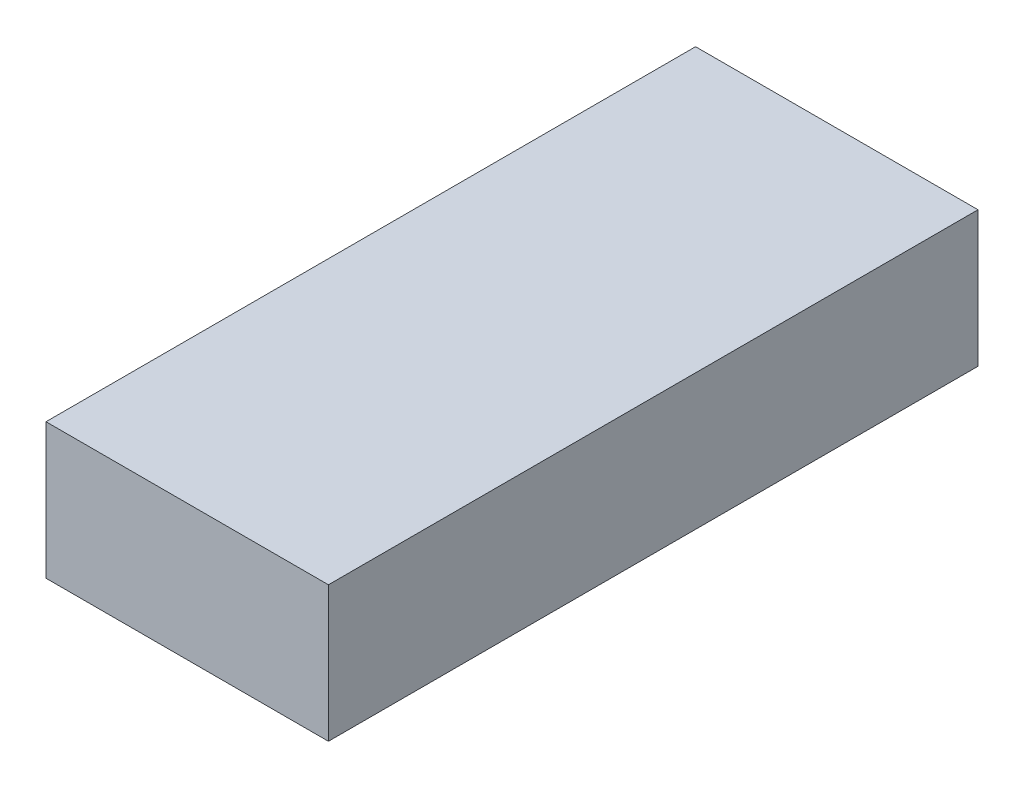
ISO-10303-21;
HEADER;
FILE_DESCRIPTION(('STEP AP214'),'2;1');
FILE_NAME('part.step','',(''),(''),'','','');
FILE_SCHEMA(('AUTOMOTIVE_DESIGN { 1 0 10303 214 1 1 1 1 }'));
ENDSEC;
DATA;
#1=APPLICATION_CONTEXT('core data for automotive mechanical design processes');
#2=APPLICATION_PROTOCOL_DEFINITION('international standard','automotive_design',2000,#1);
#3=PRODUCT_CONTEXT('',#1,'mechanical');
#4=PRODUCT('Part','Part','',(#3));
#5=PRODUCT_RELATED_PRODUCT_CATEGORY('part','',(#4));
#6=PRODUCT_DEFINITION_FORMATION('','',#4);
#7=PRODUCT_DEFINITION_CONTEXT('part definition',#1,'design');
#8=PRODUCT_DEFINITION('design','',#6,#7);
#9=PRODUCT_DEFINITION_SHAPE('','',#8);
#10=(LENGTH_UNIT() NAMED_UNIT(*) SI_UNIT(.MILLI.,.METRE.));
#11=(NAMED_UNIT(*) PLANE_ANGLE_UNIT() SI_UNIT($,.RADIAN.));
#12=(NAMED_UNIT(*) SI_UNIT($,.STERADIAN.) SOLID_ANGLE_UNIT());
#13=UNCERTAINTY_MEASURE_WITH_UNIT(LENGTH_MEASURE(1.E-05),#10,'distance_accuracy_value','');
#14=(GEOMETRIC_REPRESENTATION_CONTEXT(3) GLOBAL_UNCERTAINTY_ASSIGNED_CONTEXT((#13)) GLOBAL_UNIT_ASSIGNED_CONTEXT((#10,
#11,#12)) REPRESENTATION_CONTEXT('',''));
#15=CARTESIAN_POINT('',(0.,0.,0.));
#16=DIRECTION('',(0.,0.,1.));
#17=DIRECTION('',(1.,0.,0.));
#18=AXIS2_PLACEMENT_3D('',#15,#16,#17);
#19=CARTESIAN_POINT('',(10.,7.6,21.));
#20=DIRECTION('',(-1.,0.,0.));
#21=DIRECTION('',(0.,0.,1.));
#22=AXIS2_PLACEMENT_3D('',#19,#20,#21);
#23=PLANE('',#22);
#24=DIRECTION('',(0.,0.,-1.));
#25=VECTOR('',#24,1.);
#26=CARTESIAN_POINT('',(10.,0.,21.));
#27=LINE('',#26,#25);
#28=CARTESIAN_POINT('',(10.,0.,23.));
#29=VERTEX_POINT('',#28);
#30=CARTESIAN_POINT('',(10.,0.,-23.));
#31=VERTEX_POINT('',#30);
#32=EDGE_CURVE('E53',#29,#31,#27,.T.);
#33=ORIENTED_EDGE('',*,*,#32,.T.);
#34=DIRECTION('',(0.,1.,0.));
#35=VECTOR('',#34,1.);
#36=CARTESIAN_POINT('',(10.,7.6,-23.));
#37=LINE('',#36,#35);
#38=CARTESIAN_POINT('',(10.,9.6,-23.));
#39=VERTEX_POINT('',#38);
#40=EDGE_CURVE('E257',#39,#31,#37,.F.);
#41=ORIENTED_EDGE('',*,*,#40,.F.);
#42=DIRECTION('',(0.,0.,-1.));
#43=VECTOR('',#42,1.);
#44=CARTESIAN_POINT('',(10.,9.6,0.));
#45=LINE('',#44,#43);
#46=CARTESIAN_POINT('',(10.,9.6,23.));
#47=VERTEX_POINT('',#46);
#48=EDGE_CURVE('E240',#47,#39,#45,.T.);
#49=ORIENTED_EDGE('',*,*,#48,.F.);
#50=DIRECTION('',(0.,1.,0.));
#51=VECTOR('',#50,1.);
#52=CARTESIAN_POINT('',(10.,7.6,23.));
#53=LINE('',#52,#51);
#54=EDGE_CURVE('E261',#47,#29,#53,.F.);
#55=ORIENTED_EDGE('',*,*,#54,.T.);
#56=EDGE_LOOP('',(#33,#41,#49,#55));
#57=FACE_BOUND('',#56,.T.);
#58=ADVANCED_FACE('F46',(#57),#23,.F.);
#59=CARTESIAN_POINT('',(-10.,7.6,21.));
#60=DIRECTION('',(1.,0.,0.));
#61=DIRECTION('',(0.,0.,-1.));
#62=AXIS2_PLACEMENT_3D('',#59,#60,#61);
#63=PLANE('',#62);
#64=DIRECTION('',(0.,1.,0.));
#65=VECTOR('',#64,1.);
#66=CARTESIAN_POINT('',(-10.,7.6,-23.));
#67=LINE('',#66,#65);
#68=CARTESIAN_POINT('',(-10.,9.6,-23.));
#69=VERTEX_POINT('',#68);
#70=CARTESIAN_POINT('',(-10.,0.,-23.));
#71=VERTEX_POINT('',#70);
#72=EDGE_CURVE('E255',#69,#71,#67,.F.);
#73=ORIENTED_EDGE('',*,*,#72,.T.);
#74=DIRECTION('',(0.,0.,1.));
#75=VECTOR('',#74,1.);
#76=CARTESIAN_POINT('',(-10.,0.,21.));
#77=LINE('',#76,#75);
#78=CARTESIAN_POINT('',(-10.,0.,23.));
#79=VERTEX_POINT('',#78);
#80=EDGE_CURVE('E11',#71,#79,#77,.T.);
#81=ORIENTED_EDGE('',*,*,#80,.T.);
#82=DIRECTION('',(0.,1.,0.));
#83=VECTOR('',#82,1.);
#84=CARTESIAN_POINT('',(-10.,7.6,23.));
#85=LINE('',#84,#83);
#86=CARTESIAN_POINT('',(-10.,9.6,23.));
#87=VERTEX_POINT('',#86);
#88=EDGE_CURVE('E256',#87,#79,#85,.F.);
#89=ORIENTED_EDGE('',*,*,#88,.F.);
#90=DIRECTION('',(0.,0.,-1.));
#91=VECTOR('',#90,1.);
#92=CARTESIAN_POINT('',(-10.,9.6,0.));
#93=LINE('',#92,#91);
#94=EDGE_CURVE('E247',#69,#87,#93,.F.);
#95=ORIENTED_EDGE('',*,*,#94,.F.);
#96=EDGE_LOOP('',(#73,#81,#89,#95));
#97=FACE_BOUND('',#96,.T.);
#98=ADVANCED_FACE('F414',(#97),#63,.F.);
#99=CARTESIAN_POINT('',(0.,0.,0.));
#100=DIRECTION('',(0.,-1.,0.));
#101=DIRECTION('',(0.,0.,-1.));
#102=AXIS2_PLACEMENT_3D('',#99,#100,#101);
#103=PLANE('',#102);
#104=CARTESIAN_POINT('',(-5.5,0.,-5.50000000000001));
#105=DIRECTION('',(0.,1.,0.));
#106=DIRECTION('',(0.,0.,-1.));
#107=AXIS2_PLACEMENT_3D('',#104,#105,#106);
#108=CIRCLE('',#107,2.);
#109=CARTESIAN_POINT('',(-5.50000000000001,0.,-3.5));
#110=VERTEX_POINT('',#109);
#111=CARTESIAN_POINT('',(-3.5,0.,-5.50000000000002));
#112=VERTEX_POINT('',#111);
#113=EDGE_CURVE('E68',#110,#112,#108,.T.);
#114=ORIENTED_EDGE('',*,*,#113,.F.);
#115=DIRECTION('',(1.,0.,0.));
#116=VECTOR('',#115,1.);
#117=CARTESIAN_POINT('',(-8.5,0.,-3.5));
#118=LINE('',#117,#116);
#119=CARTESIAN_POINT('',(-8.5,0.,-3.5));
#120=VERTEX_POINT('',#119);
#121=EDGE_CURVE('E275',#120,#110,#118,.T.);
#122=ORIENTED_EDGE('',*,*,#121,.F.);
#123=DIRECTION('',(0.,0.,-1.));
#124=VECTOR('',#123,1.);
#125=CARTESIAN_POINT('',(-8.5,0.,-3.5));
#126=LINE('',#125,#124);
#127=CARTESIAN_POINT('',(-8.5,0.,0.499999999999995));
#128=VERTEX_POINT('',#127);
#129=EDGE_CURVE('E361',#128,#120,#126,.T.);
#130=ORIENTED_EDGE('',*,*,#129,.F.);
#131=DIRECTION('',(-1.,0.,0.));
#132=VECTOR('',#131,1.);
#133=CARTESIAN_POINT('',(-8.5,0.,0.499999999999995));
#134=LINE('',#133,#132);
#135=CARTESIAN_POINT('',(-5.50000000000001,0.,0.499999999999996));
#136=VERTEX_POINT('',#135);
#137=EDGE_CURVE('E358',#136,#128,#134,.T.);
#138=ORIENTED_EDGE('',*,*,#137,.F.);
#139=CARTESIAN_POINT('',(-5.5,0.,2.5));
#140=DIRECTION('',(0.,1.,0.));
#141=DIRECTION('',(0.,0.,1.));
#142=AXIS2_PLACEMENT_3D('',#139,#140,#141);
#143=CIRCLE('',#142,2.);
#144=CARTESIAN_POINT('',(-3.5,0.,2.50000000000001));
#145=VERTEX_POINT('',#144);
#146=EDGE_CURVE('E355',#145,#136,#143,.T.);
#147=ORIENTED_EDGE('',*,*,#146,.F.);
#148=DIRECTION('',(0.,0.,-1.));
#149=VECTOR('',#148,1.);
#150=CARTESIAN_POINT('',(-3.5,0.,2.50000000000001));
#151=LINE('',#150,#149);
#152=CARTESIAN_POINT('',(-3.5,0.,17.5));
#153=VERTEX_POINT('',#152);
#154=EDGE_CURVE('E352',#153,#145,#151,.T.);
#155=ORIENTED_EDGE('',*,*,#154,.F.);
#156=DIRECTION('',(-1.,0.,0.));
#157=VECTOR('',#156,1.);
#158=CARTESIAN_POINT('',(-3.5,0.,17.5));
#159=LINE('',#158,#157);
#160=CARTESIAN_POINT('',(3.5,0.,17.5));
#161=VERTEX_POINT('',#160);
#162=EDGE_CURVE('E349',#161,#153,#159,.T.);
#163=ORIENTED_EDGE('',*,*,#162,.F.);
#164=DIRECTION('',(0.,0.,1.));
#165=VECTOR('',#164,1.);
#166=CARTESIAN_POINT('',(3.5,0.,2.50000000000001));
#167=LINE('',#166,#165);
#168=CARTESIAN_POINT('',(3.5,0.,2.50000000000001));
#169=VERTEX_POINT('',#168);
#170=EDGE_CURVE('E346',#169,#161,#167,.T.);
#171=ORIENTED_EDGE('',*,*,#170,.F.);
#172=CARTESIAN_POINT('',(5.5,0.,2.5));
#173=DIRECTION('',(0.,1.,0.));
#174=DIRECTION('',(0.,0.,1.));
#175=AXIS2_PLACEMENT_3D('',#172,#173,#174);
#176=CIRCLE('',#175,2.);
#177=CARTESIAN_POINT('',(5.50000000000002,0.,0.499999999999998));
#178=VERTEX_POINT('',#177);
#179=EDGE_CURVE('E343',#178,#169,#176,.T.);
#180=ORIENTED_EDGE('',*,*,#179,.F.);
#181=DIRECTION('',(-1.,0.,0.));
#182=VECTOR('',#181,1.);
#183=CARTESIAN_POINT('',(5.50000000000002,0.,0.499999999999998));
#184=LINE('',#183,#182);
#185=CARTESIAN_POINT('',(8.50000000000001,0.,0.499999999999997));
#186=VERTEX_POINT('',#185);
#187=EDGE_CURVE('E340',#186,#178,#184,.T.);
#188=ORIENTED_EDGE('',*,*,#187,.F.);
#189=DIRECTION('',(0.,0.,1.));
#190=VECTOR('',#189,1.);
#191=CARTESIAN_POINT('',(8.50000000000001,0.,-3.5));
#192=LINE('',#191,#190);
#193=CARTESIAN_POINT('',(8.50000000000001,0.,-3.5));
#194=VERTEX_POINT('',#193);
#195=EDGE_CURVE('E337',#194,#186,#192,.T.);
#196=ORIENTED_EDGE('',*,*,#195,.F.);
#197=DIRECTION('',(1.,0.,0.));
#198=VECTOR('',#197,1.);
#199=CARTESIAN_POINT('',(5.50000000000002,0.,-3.5));
#200=LINE('',#199,#198);
#201=CARTESIAN_POINT('',(5.5,0.,-3.5));
#202=VERTEX_POINT('',#201);
#203=EDGE_CURVE('E334',#202,#194,#200,.T.);
#204=ORIENTED_EDGE('',*,*,#203,.F.);
#205=CARTESIAN_POINT('',(5.5,0.,-5.5));
#206=DIRECTION('',(0.,1.,0.));
#207=DIRECTION('',(0.,0.,1.));
#208=AXIS2_PLACEMENT_3D('',#205,#206,#207);
#209=CIRCLE('',#208,2.);
#210=CARTESIAN_POINT('',(3.5,0.,-5.50000000000002));
#211=VERTEX_POINT('',#210);
#212=EDGE_CURVE('E331',#211,#202,#209,.T.);
#213=ORIENTED_EDGE('',*,*,#212,.F.);
#214=DIRECTION('',(0.,0.,1.));
#215=VECTOR('',#214,1.);
#216=CARTESIAN_POINT('',(3.5,0.,-17.5));
#217=LINE('',#216,#215);
#218=CARTESIAN_POINT('',(3.5,0.,-17.5));
#219=VERTEX_POINT('',#218);
#220=EDGE_CURVE('E328',#219,#211,#217,.T.);
#221=ORIENTED_EDGE('',*,*,#220,.F.);
#222=DIRECTION('',(1.,0.,0.));
#223=VECTOR('',#222,1.);
#224=CARTESIAN_POINT('',(-3.5,0.,-17.5));
#225=LINE('',#224,#223);
#226=CARTESIAN_POINT('',(-3.5,0.,-17.5));
#227=VERTEX_POINT('',#226);
#228=EDGE_CURVE('E325',#227,#219,#225,.T.);
#229=ORIENTED_EDGE('',*,*,#228,.F.);
#230=DIRECTION('',(0.,0.,-1.));
#231=VECTOR('',#230,1.);
#232=CARTESIAN_POINT('',(-3.5,0.,-17.5));
#233=LINE('',#232,#231);
#234=EDGE_CURVE('E322',#112,#227,#233,.T.);
#235=ORIENTED_EDGE('',*,*,#234,.F.);
#236=EDGE_LOOP('',(#114,#122,#130,#138,#147,#155,#163,#171,#180,#188,#196,#204,#213,#221,#229,#235));
#237=FACE_BOUND('',#236,.T.);
#238=ORIENTED_EDGE('',*,*,#32,.F.);
#239=DIRECTION('',(-1.,0.,0.));
#240=VECTOR('',#239,1.);
#241=CARTESIAN_POINT('',(-10.,0.,23.));
#242=LINE('',#241,#240);
#243=EDGE_CURVE('E251',#79,#29,#242,.F.);
#244=ORIENTED_EDGE('',*,*,#243,.F.);
#245=ORIENTED_EDGE('',*,*,#80,.F.);
#246=DIRECTION('',(1.,0.,0.));
#247=VECTOR('',#246,1.);
#248=CARTESIAN_POINT('',(-10.,0.,-23.));
#249=LINE('',#248,#247);
#250=EDGE_CURVE('E252',#31,#71,#249,.F.);
#251=ORIENTED_EDGE('',*,*,#250,.F.);
#252=EDGE_LOOP('',(#238,#244,#245,#251));
#253=FACE_BOUND('',#252,.T.);
#254=ADVANCED_FACE('F403',(#237,#253),#103,.T.);
#255=CARTESIAN_POINT('',(-5.5,4.,-5.50000000000001));
#256=DIRECTION('',(0.,-1.,0.));
#257=DIRECTION('',(0.,0.,-1.));
#258=AXIS2_PLACEMENT_3D('',#255,#256,#257);
#259=CYLINDRICAL_SURFACE('',#258,2.);
#260=ORIENTED_EDGE('',*,*,#113,.T.);
#261=DIRECTION('',(0.,-1.,0.));
#262=VECTOR('',#261,1.);
#263=CARTESIAN_POINT('',(-3.5,4.,-5.50000000000002));
#264=LINE('',#263,#262);
#265=CARTESIAN_POINT('',(-3.5,4.,-5.50000000000002));
#266=VERTEX_POINT('',#265);
#267=EDGE_CURVE('E320',#266,#112,#264,.T.);
#268=ORIENTED_EDGE('',*,*,#267,.F.);
#269=CARTESIAN_POINT('',(-5.5,4.,-5.50000000000001));
#270=DIRECTION('',(0.,1.,0.));
#271=DIRECTION('',(0.,0.,-1.));
#272=AXIS2_PLACEMENT_3D('',#269,#270,#271);
#273=CIRCLE('',#272,2.);
#274=CARTESIAN_POINT('',(-5.50000000000001,4.,-3.5));
#275=VERTEX_POINT('',#274);
#276=EDGE_CURVE('E271',#275,#266,#273,.T.);
#277=ORIENTED_EDGE('',*,*,#276,.F.);
#278=DIRECTION('',(0.,-1.,0.));
#279=VECTOR('',#278,1.);
#280=CARTESIAN_POINT('',(-5.50000000000001,4.,-3.5));
#281=LINE('',#280,#279);
#282=EDGE_CURVE('E366',#275,#110,#281,.T.);
#283=ORIENTED_EDGE('',*,*,#282,.T.);
#284=EDGE_LOOP('',(#260,#268,#277,#283));
#285=FACE_BOUND('',#284,.T.);
#286=ADVANCED_FACE('F420',(#285),#259,.T.);
#287=CARTESIAN_POINT('',(-8.5,4.,-3.5));
#288=DIRECTION('',(0.,0.,-1.));
#289=DIRECTION('',(-1.,0.,0.));
#290=AXIS2_PLACEMENT_3D('',#287,#288,#289);
#291=PLANE('',#290);
#292=ORIENTED_EDGE('',*,*,#121,.T.);
#293=ORIENTED_EDGE('',*,*,#282,.F.);
#294=DIRECTION('',(1.,0.,0.));
#295=VECTOR('',#294,1.);
#296=CARTESIAN_POINT('',(-8.5,4.,-3.5));
#297=LINE('',#296,#295);
#298=CARTESIAN_POINT('',(-8.5,4.,-3.5));
#299=VERTEX_POINT('',#298);
#300=EDGE_CURVE('E317',#299,#275,#297,.T.);
#301=ORIENTED_EDGE('',*,*,#300,.F.);
#302=DIRECTION('',(0.,-1.,0.));
#303=VECTOR('',#302,1.);
#304=CARTESIAN_POINT('',(-8.5,4.,-3.5));
#305=LINE('',#304,#303);
#306=EDGE_CURVE('E368',#299,#120,#305,.T.);
#307=ORIENTED_EDGE('',*,*,#306,.T.);
#308=EDGE_LOOP('',(#292,#293,#301,#307));
#309=FACE_BOUND('',#308,.T.);
#310=ADVANCED_FACE('F426',(#309),#291,.F.);
#311=CARTESIAN_POINT('',(-8.5,4.,-3.5));
#312=DIRECTION('',(-1.,0.,0.));
#313=DIRECTION('',(0.,0.,1.));
#314=AXIS2_PLACEMENT_3D('',#311,#312,#313);
#315=PLANE('',#314);
#316=ORIENTED_EDGE('',*,*,#129,.T.);
#317=ORIENTED_EDGE('',*,*,#306,.F.);
#318=DIRECTION('',(0.,0.,-1.));
#319=VECTOR('',#318,1.);
#320=CARTESIAN_POINT('',(-8.5,4.,-3.5));
#321=LINE('',#320,#319);
#322=CARTESIAN_POINT('',(-8.5,4.,0.499999999999995));
#323=VERTEX_POINT('',#322);
#324=EDGE_CURVE('E314',#323,#299,#321,.T.);
#325=ORIENTED_EDGE('',*,*,#324,.F.);
#326=DIRECTION('',(0.,-1.,0.));
#327=VECTOR('',#326,1.);
#328=CARTESIAN_POINT('',(-8.5,4.,0.499999999999995));
#329=LINE('',#328,#327);
#330=EDGE_CURVE('E370',#323,#128,#329,.T.);
#331=ORIENTED_EDGE('',*,*,#330,.T.);
#332=EDGE_LOOP('',(#316,#317,#325,#331));
#333=FACE_BOUND('',#332,.T.);
#334=ADVANCED_FACE('F479',(#333),#315,.F.);
#335=CARTESIAN_POINT('',(-8.5,4.,0.499999999999995));
#336=DIRECTION('',(0.,0.,1.));
#337=DIRECTION('',(1.,0.,0.));
#338=AXIS2_PLACEMENT_3D('',#335,#336,#337);
#339=PLANE('',#338);
#340=ORIENTED_EDGE('',*,*,#137,.T.);
#341=ORIENTED_EDGE('',*,*,#330,.F.);
#342=DIRECTION('',(-1.,0.,0.));
#343=VECTOR('',#342,1.);
#344=CARTESIAN_POINT('',(-8.5,4.,0.499999999999995));
#345=LINE('',#344,#343);
#346=CARTESIAN_POINT('',(-5.50000000000001,4.,0.499999999999996));
#347=VERTEX_POINT('',#346);
#348=EDGE_CURVE('E311',#347,#323,#345,.T.);
#349=ORIENTED_EDGE('',*,*,#348,.F.);
#350=DIRECTION('',(0.,-1.,0.));
#351=VECTOR('',#350,1.);
#352=CARTESIAN_POINT('',(-5.50000000000001,4.,0.499999999999996));
#353=LINE('',#352,#351);
#354=EDGE_CURVE('E372',#347,#136,#353,.T.);
#355=ORIENTED_EDGE('',*,*,#354,.T.);
#356=EDGE_LOOP('',(#340,#341,#349,#355));
#357=FACE_BOUND('',#356,.T.);
#358=ADVANCED_FACE('F475',(#357),#339,.F.);
#359=CARTESIAN_POINT('',(-5.5,4.,2.5));
#360=DIRECTION('',(0.,-1.,0.));
#361=DIRECTION('',(0.,0.,-1.));
#362=AXIS2_PLACEMENT_3D('',#359,#360,#361);
#363=CYLINDRICAL_SURFACE('',#362,2.);
#364=ORIENTED_EDGE('',*,*,#146,.T.);
#365=ORIENTED_EDGE('',*,*,#354,.F.);
#366=CARTESIAN_POINT('',(-5.5,4.,2.5));
#367=DIRECTION('',(0.,1.,0.));
#368=DIRECTION('',(0.,0.,1.));
#369=AXIS2_PLACEMENT_3D('',#366,#367,#368);
#370=CIRCLE('',#369,2.);
#371=CARTESIAN_POINT('',(-3.5,4.,2.50000000000001));
#372=VERTEX_POINT('',#371);
#373=EDGE_CURVE('E308',#372,#347,#370,.T.);
#374=ORIENTED_EDGE('',*,*,#373,.F.);
#375=DIRECTION('',(0.,-1.,0.));
#376=VECTOR('',#375,1.);
#377=CARTESIAN_POINT('',(-3.5,4.,2.50000000000001));
#378=LINE('',#377,#376);
#379=EDGE_CURVE('E374',#372,#145,#378,.T.);
#380=ORIENTED_EDGE('',*,*,#379,.T.);
#381=EDGE_LOOP('',(#364,#365,#374,#380));
#382=FACE_BOUND('',#381,.T.);
#383=ADVANCED_FACE('F471',(#382),#363,.T.);
#384=CARTESIAN_POINT('',(-3.5,4.,2.50000000000001));
#385=DIRECTION('',(-1.,0.,0.));
#386=DIRECTION('',(0.,0.,1.));
#387=AXIS2_PLACEMENT_3D('',#384,#385,#386);
#388=PLANE('',#387);
#389=ORIENTED_EDGE('',*,*,#154,.T.);
#390=ORIENTED_EDGE('',*,*,#379,.F.);
#391=DIRECTION('',(0.,0.,-1.));
#392=VECTOR('',#391,1.);
#393=CARTESIAN_POINT('',(-3.5,4.,2.50000000000001));
#394=LINE('',#393,#392);
#395=CARTESIAN_POINT('',(-3.5,4.,17.5));
#396=VERTEX_POINT('',#395);
#397=EDGE_CURVE('E305',#396,#372,#394,.T.);
#398=ORIENTED_EDGE('',*,*,#397,.F.);
#399=DIRECTION('',(0.,-1.,0.));
#400=VECTOR('',#399,1.);
#401=CARTESIAN_POINT('',(-3.5,4.,17.5));
#402=LINE('',#401,#400);
#403=EDGE_CURVE('E376',#396,#153,#402,.T.);
#404=ORIENTED_EDGE('',*,*,#403,.T.);
#405=EDGE_LOOP('',(#389,#390,#398,#404));
#406=FACE_BOUND('',#405,.T.);
#407=ADVANCED_FACE('F467',(#406),#388,.F.);
#408=CARTESIAN_POINT('',(-3.5,4.,17.5));
#409=DIRECTION('',(0.,0.,1.));
#410=DIRECTION('',(1.,0.,0.));
#411=AXIS2_PLACEMENT_3D('',#408,#409,#410);
#412=PLANE('',#411);
#413=ORIENTED_EDGE('',*,*,#162,.T.);
#414=ORIENTED_EDGE('',*,*,#403,.F.);
#415=DIRECTION('',(-1.,0.,0.));
#416=VECTOR('',#415,1.);
#417=CARTESIAN_POINT('',(-3.5,4.,17.5));
#418=LINE('',#417,#416);
#419=CARTESIAN_POINT('',(3.5,4.,17.5));
#420=VERTEX_POINT('',#419);
#421=EDGE_CURVE('E302',#420,#396,#418,.T.);
#422=ORIENTED_EDGE('',*,*,#421,.F.);
#423=DIRECTION('',(0.,-1.,0.));
#424=VECTOR('',#423,1.);
#425=CARTESIAN_POINT('',(3.5,4.,17.5));
#426=LINE('',#425,#424);
#427=EDGE_CURVE('E378',#420,#161,#426,.T.);
#428=ORIENTED_EDGE('',*,*,#427,.T.);
#429=EDGE_LOOP('',(#413,#414,#422,#428));
#430=FACE_BOUND('',#429,.T.);
#431=ADVANCED_FACE('F463',(#430),#412,.F.);
#432=CARTESIAN_POINT('',(3.5,4.,2.50000000000001));
#433=DIRECTION('',(1.,0.,0.));
#434=DIRECTION('',(0.,0.,-1.));
#435=AXIS2_PLACEMENT_3D('',#432,#433,#434);
#436=PLANE('',#435);
#437=ORIENTED_EDGE('',*,*,#170,.T.);
#438=ORIENTED_EDGE('',*,*,#427,.F.);
#439=DIRECTION('',(0.,0.,1.));
#440=VECTOR('',#439,1.);
#441=CARTESIAN_POINT('',(3.5,4.,2.50000000000001));
#442=LINE('',#441,#440);
#443=CARTESIAN_POINT('',(3.5,4.,2.50000000000001));
#444=VERTEX_POINT('',#443);
#445=EDGE_CURVE('E299',#444,#420,#442,.T.);
#446=ORIENTED_EDGE('',*,*,#445,.F.);
#447=DIRECTION('',(0.,-1.,0.));
#448=VECTOR('',#447,1.);
#449=CARTESIAN_POINT('',(3.5,4.,2.50000000000001));
#450=LINE('',#449,#448);
#451=EDGE_CURVE('E380',#444,#169,#450,.T.);
#452=ORIENTED_EDGE('',*,*,#451,.T.);
#453=EDGE_LOOP('',(#437,#438,#446,#452));
#454=FACE_BOUND('',#453,.T.);
#455=ADVANCED_FACE('F459',(#454),#436,.F.);
#456=CARTESIAN_POINT('',(5.5,4.,2.5));
#457=DIRECTION('',(0.,-1.,0.));
#458=DIRECTION('',(0.,0.,-1.));
#459=AXIS2_PLACEMENT_3D('',#456,#457,#458);
#460=CYLINDRICAL_SURFACE('',#459,2.);
#461=ORIENTED_EDGE('',*,*,#179,.T.);
#462=ORIENTED_EDGE('',*,*,#451,.F.);
#463=CARTESIAN_POINT('',(5.5,4.,2.5));
#464=DIRECTION('',(0.,1.,0.));
#465=DIRECTION('',(0.,0.,1.));
#466=AXIS2_PLACEMENT_3D('',#463,#464,#465);
#467=CIRCLE('',#466,2.);
#468=CARTESIAN_POINT('',(5.50000000000002,4.,0.499999999999998));
#469=VERTEX_POINT('',#468);
#470=EDGE_CURVE('E296',#469,#444,#467,.T.);
#471=ORIENTED_EDGE('',*,*,#470,.F.);
#472=DIRECTION('',(0.,-1.,0.));
#473=VECTOR('',#472,1.);
#474=CARTESIAN_POINT('',(5.50000000000002,4.,0.499999999999998));
#475=LINE('',#474,#473);
#476=EDGE_CURVE('E382',#469,#178,#475,.T.);
#477=ORIENTED_EDGE('',*,*,#476,.T.);
#478=EDGE_LOOP('',(#461,#462,#471,#477));
#479=FACE_BOUND('',#478,.T.);
#480=ADVANCED_FACE('F455',(#479),#460,.T.);
#481=CARTESIAN_POINT('',(5.50000000000002,4.,0.499999999999998));
#482=DIRECTION('',(0.,0.,1.));
#483=DIRECTION('',(1.,0.,0.));
#484=AXIS2_PLACEMENT_3D('',#481,#482,#483);
#485=PLANE('',#484);
#486=ORIENTED_EDGE('',*,*,#187,.T.);
#487=ORIENTED_EDGE('',*,*,#476,.F.);
#488=DIRECTION('',(-1.,0.,0.));
#489=VECTOR('',#488,1.);
#490=CARTESIAN_POINT('',(5.50000000000002,4.,0.499999999999998));
#491=LINE('',#490,#489);
#492=CARTESIAN_POINT('',(8.50000000000001,4.,0.499999999999997));
#493=VERTEX_POINT('',#492);
#494=EDGE_CURVE('E293',#493,#469,#491,.T.);
#495=ORIENTED_EDGE('',*,*,#494,.F.);
#496=DIRECTION('',(0.,-1.,0.));
#497=VECTOR('',#496,1.);
#498=CARTESIAN_POINT('',(8.50000000000001,4.,0.499999999999997));
#499=LINE('',#498,#497);
#500=EDGE_CURVE('E384',#493,#186,#499,.T.);
#501=ORIENTED_EDGE('',*,*,#500,.T.);
#502=EDGE_LOOP('',(#486,#487,#495,#501));
#503=FACE_BOUND('',#502,.T.);
#504=ADVANCED_FACE('F451',(#503),#485,.F.);
#505=CARTESIAN_POINT('',(8.50000000000001,4.,-3.5));
#506=DIRECTION('',(1.,0.,0.));
#507=DIRECTION('',(0.,0.,-1.));
#508=AXIS2_PLACEMENT_3D('',#505,#506,#507);
#509=PLANE('',#508);
#510=ORIENTED_EDGE('',*,*,#195,.T.);
#511=ORIENTED_EDGE('',*,*,#500,.F.);
#512=DIRECTION('',(0.,0.,1.));
#513=VECTOR('',#512,1.);
#514=CARTESIAN_POINT('',(8.50000000000001,4.,-3.5));
#515=LINE('',#514,#513);
#516=CARTESIAN_POINT('',(8.50000000000001,4.,-3.5));
#517=VERTEX_POINT('',#516);
#518=EDGE_CURVE('E290',#517,#493,#515,.T.);
#519=ORIENTED_EDGE('',*,*,#518,.F.);
#520=DIRECTION('',(0.,-1.,0.));
#521=VECTOR('',#520,1.);
#522=CARTESIAN_POINT('',(8.50000000000001,4.,-3.5));
#523=LINE('',#522,#521);
#524=EDGE_CURVE('E386',#517,#194,#523,.T.);
#525=ORIENTED_EDGE('',*,*,#524,.T.);
#526=EDGE_LOOP('',(#510,#511,#519,#525));
#527=FACE_BOUND('',#526,.T.);
#528=ADVANCED_FACE('F447',(#527),#509,.F.);
#529=CARTESIAN_POINT('',(5.50000000000002,4.,-3.5));
#530=DIRECTION('',(0.,0.,-1.));
#531=DIRECTION('',(-1.,0.,0.));
#532=AXIS2_PLACEMENT_3D('',#529,#530,#531);
#533=PLANE('',#532);
#534=ORIENTED_EDGE('',*,*,#203,.T.);
#535=ORIENTED_EDGE('',*,*,#524,.F.);
#536=DIRECTION('',(1.,0.,0.));
#537=VECTOR('',#536,1.);
#538=CARTESIAN_POINT('',(5.50000000000002,4.,-3.5));
#539=LINE('',#538,#537);
#540=CARTESIAN_POINT('',(5.5,4.,-3.5));
#541=VERTEX_POINT('',#540);
#542=EDGE_CURVE('E287',#541,#517,#539,.T.);
#543=ORIENTED_EDGE('',*,*,#542,.F.);
#544=DIRECTION('',(0.,-1.,0.));
#545=VECTOR('',#544,1.);
#546=CARTESIAN_POINT('',(5.5,4.,-3.5));
#547=LINE('',#546,#545);
#548=EDGE_CURVE('E388',#541,#202,#547,.T.);
#549=ORIENTED_EDGE('',*,*,#548,.T.);
#550=EDGE_LOOP('',(#534,#535,#543,#549));
#551=FACE_BOUND('',#550,.T.);
#552=ADVANCED_FACE('F443',(#551),#533,.F.);
#553=CARTESIAN_POINT('',(5.5,4.,-5.5));
#554=DIRECTION('',(0.,-1.,0.));
#555=DIRECTION('',(0.,0.,-1.));
#556=AXIS2_PLACEMENT_3D('',#553,#554,#555);
#557=CYLINDRICAL_SURFACE('',#556,2.);
#558=ORIENTED_EDGE('',*,*,#212,.T.);
#559=ORIENTED_EDGE('',*,*,#548,.F.);
#560=CARTESIAN_POINT('',(5.5,4.,-5.5));
#561=DIRECTION('',(0.,1.,0.));
#562=DIRECTION('',(0.,0.,1.));
#563=AXIS2_PLACEMENT_3D('',#560,#561,#562);
#564=CIRCLE('',#563,2.);
#565=CARTESIAN_POINT('',(3.5,4.,-5.50000000000002));
#566=VERTEX_POINT('',#565);
#567=EDGE_CURVE('E284',#566,#541,#564,.T.);
#568=ORIENTED_EDGE('',*,*,#567,.F.);
#569=DIRECTION('',(0.,-1.,0.));
#570=VECTOR('',#569,1.);
#571=CARTESIAN_POINT('',(3.5,4.,-5.50000000000002));
#572=LINE('',#571,#570);
#573=EDGE_CURVE('E390',#566,#211,#572,.T.);
#574=ORIENTED_EDGE('',*,*,#573,.T.);
#575=EDGE_LOOP('',(#558,#559,#568,#574));
#576=FACE_BOUND('',#575,.T.);
#577=ADVANCED_FACE('F439',(#576),#557,.T.);
#578=CARTESIAN_POINT('',(3.5,4.,-17.5));
#579=DIRECTION('',(1.,0.,0.));
#580=DIRECTION('',(0.,0.,-1.));
#581=AXIS2_PLACEMENT_3D('',#578,#579,#580);
#582=PLANE('',#581);
#583=ORIENTED_EDGE('',*,*,#220,.T.);
#584=ORIENTED_EDGE('',*,*,#573,.F.);
#585=DIRECTION('',(0.,0.,1.));
#586=VECTOR('',#585,1.);
#587=CARTESIAN_POINT('',(3.5,4.,-17.5));
#588=LINE('',#587,#586);
#589=CARTESIAN_POINT('',(3.5,4.,-17.5));
#590=VERTEX_POINT('',#589);
#591=EDGE_CURVE('E281',#590,#566,#588,.T.);
#592=ORIENTED_EDGE('',*,*,#591,.F.);
#593=DIRECTION('',(0.,-1.,0.));
#594=VECTOR('',#593,1.);
#595=CARTESIAN_POINT('',(3.5,4.,-17.5));
#596=LINE('',#595,#594);
#597=EDGE_CURVE('E392',#590,#219,#596,.T.);
#598=ORIENTED_EDGE('',*,*,#597,.T.);
#599=EDGE_LOOP('',(#583,#584,#592,#598));
#600=FACE_BOUND('',#599,.T.);
#601=ADVANCED_FACE('F435',(#600),#582,.F.);
#602=CARTESIAN_POINT('',(-3.5,4.,-17.5));
#603=DIRECTION('',(0.,0.,-1.));
#604=DIRECTION('',(-1.,0.,0.));
#605=AXIS2_PLACEMENT_3D('',#602,#603,#604);
#606=PLANE('',#605);
#607=ORIENTED_EDGE('',*,*,#228,.T.);
#608=ORIENTED_EDGE('',*,*,#597,.F.);
#609=DIRECTION('',(1.,0.,0.));
#610=VECTOR('',#609,1.);
#611=CARTESIAN_POINT('',(-3.5,4.,-17.5));
#612=LINE('',#611,#610);
#613=CARTESIAN_POINT('',(-3.5,4.,-17.5));
#614=VERTEX_POINT('',#613);
#615=EDGE_CURVE('E278',#614,#590,#612,.T.);
#616=ORIENTED_EDGE('',*,*,#615,.F.);
#617=DIRECTION('',(0.,-1.,0.));
#618=VECTOR('',#617,1.);
#619=CARTESIAN_POINT('',(-3.5,4.,-17.5));
#620=LINE('',#619,#618);
#621=EDGE_CURVE('E394',#614,#227,#620,.T.);
#622=ORIENTED_EDGE('',*,*,#621,.T.);
#623=EDGE_LOOP('',(#607,#608,#616,#622));
#624=FACE_BOUND('',#623,.T.);
#625=ADVANCED_FACE('F431',(#624),#606,.F.);
#626=CARTESIAN_POINT('',(-3.5,4.,-17.5));
#627=DIRECTION('',(-1.,0.,0.));
#628=DIRECTION('',(0.,0.,1.));
#629=AXIS2_PLACEMENT_3D('',#626,#627,#628);
#630=PLANE('',#629);
#631=ORIENTED_EDGE('',*,*,#234,.T.);
#632=ORIENTED_EDGE('',*,*,#621,.F.);
#633=DIRECTION('',(0.,0.,-1.));
#634=VECTOR('',#633,1.);
#635=CARTESIAN_POINT('',(-3.5,4.,-17.5));
#636=LINE('',#635,#634);
#637=EDGE_CURVE('E274',#266,#614,#636,.T.);
#638=ORIENTED_EDGE('',*,*,#637,.F.);
#639=ORIENTED_EDGE('',*,*,#267,.T.);
#640=EDGE_LOOP('',(#631,#632,#638,#639));
#641=FACE_BOUND('',#640,.T.);
#642=ADVANCED_FACE('F427',(#641),#630,.F.);
#643=CARTESIAN_POINT('',(-5.5,4.,-5.50000000000001));
#644=DIRECTION('',(0.,-1.,0.));
#645=DIRECTION('',(0.,0.,-1.));
#646=AXIS2_PLACEMENT_3D('',#643,#644,#645);
#647=PLANE('',#646);
#648=ORIENTED_EDGE('',*,*,#276,.T.);
#649=ORIENTED_EDGE('',*,*,#637,.T.);
#650=ORIENTED_EDGE('',*,*,#615,.T.);
#651=ORIENTED_EDGE('',*,*,#591,.T.);
#652=ORIENTED_EDGE('',*,*,#567,.T.);
#653=ORIENTED_EDGE('',*,*,#542,.T.);
#654=ORIENTED_EDGE('',*,*,#518,.T.);
#655=ORIENTED_EDGE('',*,*,#494,.T.);
#656=ORIENTED_EDGE('',*,*,#470,.T.);
#657=ORIENTED_EDGE('',*,*,#445,.T.);
#658=ORIENTED_EDGE('',*,*,#421,.T.);
#659=ORIENTED_EDGE('',*,*,#397,.T.);
#660=ORIENTED_EDGE('',*,*,#373,.T.);
#661=ORIENTED_EDGE('',*,*,#348,.T.);
#662=ORIENTED_EDGE('',*,*,#324,.T.);
#663=ORIENTED_EDGE('',*,*,#300,.T.);
#664=EDGE_LOOP('',(#648,#649,#650,#651,#652,#653,#654,#655,#656,#657,#658,#659,#660,#661,#662,#663));
#665=FACE_BOUND('',#664,.T.);
#666=ADVANCED_FACE('F430',(#665),#647,.T.);
#667=CARTESIAN_POINT('',(-10.,7.6,-23.));
#668=DIRECTION('',(0.,0.,1.));
#669=DIRECTION('',(1.,0.,0.));
#670=AXIS2_PLACEMENT_3D('',#667,#668,#669);
#671=PLANE('',#670);
#672=DIRECTION('',(-1.,0.,0.));
#673=VECTOR('',#672,1.);
#674=CARTESIAN_POINT('',(8.,6.4,-23.));
#675=LINE('',#674,#673);
#676=CARTESIAN_POINT('',(8.,6.4,-23.));
#677=VERTEX_POINT('',#676);
#678=CARTESIAN_POINT('',(-8.,6.4,-23.));
#679=VERTEX_POINT('',#678);
#680=EDGE_CURVE('E234',#677,#679,#675,.T.);
#681=ORIENTED_EDGE('',*,*,#680,.F.);
#682=DIRECTION('',(0.,-1.,0.));
#683=VECTOR('',#682,1.);
#684=CARTESIAN_POINT('',(8.,8.,-23.));
#685=LINE('',#684,#683);
#686=CARTESIAN_POINT('',(8.,8.,-23.));
#687=VERTEX_POINT('',#686);
#688=EDGE_CURVE('E60',#687,#677,#685,.T.);
#689=ORIENTED_EDGE('',*,*,#688,.F.);
#690=DIRECTION('',(1.,0.,0.));
#691=VECTOR('',#690,1.);
#692=CARTESIAN_POINT('',(8.,8.,-23.));
#693=LINE('',#692,#691);
#694=CARTESIAN_POINT('',(-8.,8.,-23.));
#695=VERTEX_POINT('',#694);
#696=EDGE_CURVE('E225',#695,#687,#693,.T.);
#697=ORIENTED_EDGE('',*,*,#696,.F.);
#698=DIRECTION('',(0.,1.,0.));
#699=VECTOR('',#698,1.);
#700=CARTESIAN_POINT('',(-8.,8.,-23.));
#701=LINE('',#700,#699);
#702=EDGE_CURVE('E228',#679,#695,#701,.T.);
#703=ORIENTED_EDGE('',*,*,#702,.F.);
#704=EDGE_LOOP('',(#681,#689,#697,#703));
#705=FACE_BOUND('',#704,.T.);
#706=ORIENTED_EDGE('',*,*,#250,.T.);
#707=ORIENTED_EDGE('',*,*,#72,.F.);
#708=DIRECTION('',(-1.,0.,0.));
#709=VECTOR('',#708,1.);
#710=CARTESIAN_POINT('',(0.,9.6,-23.));
#711=LINE('',#710,#709);
#712=EDGE_CURVE('E244',#39,#69,#711,.T.);
#713=ORIENTED_EDGE('',*,*,#712,.F.);
#714=ORIENTED_EDGE('',*,*,#40,.T.);
#715=EDGE_LOOP('',(#706,#707,#713,#714));
#716=FACE_BOUND('',#715,.T.);
#717=ADVANCED_FACE('F405',(#705,#716),#671,.F.);
#718=CARTESIAN_POINT('',(-10.,7.6,23.));
#719=DIRECTION('',(0.,0.,-1.));
#720=DIRECTION('',(-1.,0.,0.));
#721=AXIS2_PLACEMENT_3D('',#718,#719,#720);
#722=PLANE('',#721);
#723=ORIENTED_EDGE('',*,*,#243,.T.);
#724=ORIENTED_EDGE('',*,*,#54,.F.);
#725=DIRECTION('',(1.,0.,0.));
#726=VECTOR('',#725,1.);
#727=CARTESIAN_POINT('',(0.,9.6,23.));
#728=LINE('',#727,#726);
#729=EDGE_CURVE('E248',#87,#47,#728,.T.);
#730=ORIENTED_EDGE('',*,*,#729,.F.);
#731=ORIENTED_EDGE('',*,*,#88,.T.);
#732=EDGE_LOOP('',(#723,#724,#730,#731));
#733=FACE_BOUND('',#732,.T.);
#734=ADVANCED_FACE('F412',(#733),#722,.F.);
#735=CARTESIAN_POINT('',(0.,9.6,0.));
#736=DIRECTION('',(0.,-1.,0.));
#737=DIRECTION('',(0.,0.,-1.));
#738=AXIS2_PLACEMENT_3D('',#735,#736,#737);
#739=PLANE('',#738);
#740=ORIENTED_EDGE('',*,*,#48,.T.);
#741=ORIENTED_EDGE('',*,*,#712,.T.);
#742=ORIENTED_EDGE('',*,*,#94,.T.);
#743=ORIENTED_EDGE('',*,*,#729,.T.);
#744=EDGE_LOOP('',(#740,#741,#742,#743));
#745=FACE_BOUND('',#744,.T.);
#746=ADVANCED_FACE('F408',(#745),#739,.F.);
#747=CARTESIAN_POINT('',(8.,8.,-8.));
#748=DIRECTION('',(1.,0.,0.));
#749=DIRECTION('',(0.,1.,0.));
#750=AXIS2_PLACEMENT_3D('',#747,#748,#749);
#751=PLANE('',#750);
#752=ORIENTED_EDGE('',*,*,#688,.T.);
#753=DIRECTION('',(0.,0.,-1.));
#754=VECTOR('',#753,1.);
#755=CARTESIAN_POINT('',(8.,6.4,-8.));
#756=LINE('',#755,#754);
#757=CARTESIAN_POINT('',(8.,6.4,-8.));
#758=VERTEX_POINT('',#757);
#759=EDGE_CURVE('E203',#758,#677,#756,.T.);
#760=ORIENTED_EDGE('',*,*,#759,.F.);
#761=DIRECTION('',(0.,-1.,0.));
#762=VECTOR('',#761,1.);
#763=CARTESIAN_POINT('',(8.,8.,-8.));
#764=LINE('',#763,#762);
#765=CARTESIAN_POINT('',(8.,8.,-8.));
#766=VERTEX_POINT('',#765);
#767=EDGE_CURVE('E207',#766,#758,#764,.T.);
#768=ORIENTED_EDGE('',*,*,#767,.F.);
#769=DIRECTION('',(0.,0.,-1.));
#770=VECTOR('',#769,1.);
#771=CARTESIAN_POINT('',(8.,8.,-8.));
#772=LINE('',#771,#770);
#773=EDGE_CURVE('E238',#766,#687,#772,.T.);
#774=ORIENTED_EDGE('',*,*,#773,.T.);
#775=EDGE_LOOP('',(#752,#760,#768,#774));
#776=FACE_BOUND('',#775,.T.);
#777=ADVANCED_FACE('F205',(#776),#751,.F.);
#778=CARTESIAN_POINT('',(8.,8.,-8.));
#779=DIRECTION('',(0.,1.,0.));
#780=DIRECTION('',(0.,0.,1.));
#781=AXIS2_PLACEMENT_3D('',#778,#779,#780);
#782=PLANE('',#781);
#783=ORIENTED_EDGE('',*,*,#696,.T.);
#784=ORIENTED_EDGE('',*,*,#773,.F.);
#785=DIRECTION('',(1.,0.,0.));
#786=VECTOR('',#785,1.);
#787=CARTESIAN_POINT('',(8.,8.,-8.));
#788=LINE('',#787,#786);
#789=CARTESIAN_POINT('',(-8.,8.,-8.));
#790=VERTEX_POINT('',#789);
#791=EDGE_CURVE('E213',#790,#766,#788,.T.);
#792=ORIENTED_EDGE('',*,*,#791,.F.);
#793=DIRECTION('',(0.,0.,-1.));
#794=VECTOR('',#793,1.);
#795=CARTESIAN_POINT('',(-8.,8.,-8.));
#796=LINE('',#795,#794);
#797=EDGE_CURVE('E241',#790,#695,#796,.T.);
#798=ORIENTED_EDGE('',*,*,#797,.T.);
#799=EDGE_LOOP('',(#783,#784,#792,#798));
#800=FACE_BOUND('',#799,.T.);
#801=ADVANCED_FACE('F499',(#800),#782,.F.);
#802=CARTESIAN_POINT('',(-8.,8.,-8.));
#803=DIRECTION('',(-1.,0.,0.));
#804=DIRECTION('',(0.,-1.,0.));
#805=AXIS2_PLACEMENT_3D('',#802,#803,#804);
#806=PLANE('',#805);
#807=ORIENTED_EDGE('',*,*,#702,.T.);
#808=ORIENTED_EDGE('',*,*,#797,.F.);
#809=DIRECTION('',(0.,1.,0.));
#810=VECTOR('',#809,1.);
#811=CARTESIAN_POINT('',(-8.,8.,-8.));
#812=LINE('',#811,#810);
#813=CARTESIAN_POINT('',(-8.,6.4,-8.));
#814=VERTEX_POINT('',#813);
#815=EDGE_CURVE('E221',#814,#790,#812,.T.);
#816=ORIENTED_EDGE('',*,*,#815,.F.);
#817=DIRECTION('',(0.,0.,-1.));
#818=VECTOR('',#817,1.);
#819=CARTESIAN_POINT('',(-8.,6.4,-8.));
#820=LINE('',#819,#818);
#821=EDGE_CURVE('E212',#814,#679,#820,.T.);
#822=ORIENTED_EDGE('',*,*,#821,.T.);
#823=EDGE_LOOP('',(#807,#808,#816,#822));
#824=FACE_BOUND('',#823,.T.);
#825=ADVANCED_FACE('F502',(#824),#806,.F.);
#826=CARTESIAN_POINT('',(8.,6.4,-8.));
#827=DIRECTION('',(0.,-1.,0.));
#828=DIRECTION('',(0.,0.,-1.));
#829=AXIS2_PLACEMENT_3D('',#826,#827,#828);
#830=PLANE('',#829);
#831=ORIENTED_EDGE('',*,*,#680,.T.);
#832=ORIENTED_EDGE('',*,*,#821,.F.);
#833=DIRECTION('',(-1.,0.,0.));
#834=VECTOR('',#833,1.);
#835=CARTESIAN_POINT('',(8.,6.4,-8.));
#836=LINE('',#835,#834);
#837=EDGE_CURVE('E216',#758,#814,#836,.T.);
#838=ORIENTED_EDGE('',*,*,#837,.F.);
#839=ORIENTED_EDGE('',*,*,#759,.T.);
#840=EDGE_LOOP('',(#831,#832,#838,#839));
#841=FACE_BOUND('',#840,.T.);
#842=ADVANCED_FACE('F217',(#841),#830,.F.);
#843=CARTESIAN_POINT('',(0.,0.,-8.));
#844=DIRECTION('',(0.,0.,-1.));
#845=DIRECTION('',(-1.,0.,0.));
#846=AXIS2_PLACEMENT_3D('',#843,#844,#845);
#847=PLANE('',#846);
#848=ORIENTED_EDGE('',*,*,#767,.T.);
#849=ORIENTED_EDGE('',*,*,#837,.T.);
#850=ORIENTED_EDGE('',*,*,#815,.T.);
#851=ORIENTED_EDGE('',*,*,#791,.T.);
#852=EDGE_LOOP('',(#848,#849,#850,#851));
#853=FACE_BOUND('',#852,.T.);
#854=ADVANCED_FACE('F223',(#853),#847,.T.);
#855=CLOSED_SHELL('',(#58,#98,#254,#286,#310,#334,#358,#383,#407,#431,#455,#480,#504,#528,#552,
#577,#601,#625,#642,#666,#717,#734,#746,#777,#801,#825,#842,#854));
#856=MANIFOLD_SOLID_BREP('B2',#855);
#857=ADVANCED_BREP_SHAPE_REPRESENTATION('',(#18,#856),#14);
#858=SHAPE_DEFINITION_REPRESENTATION(#9,#857);
ENDSEC;
END-ISO-10303-21;
